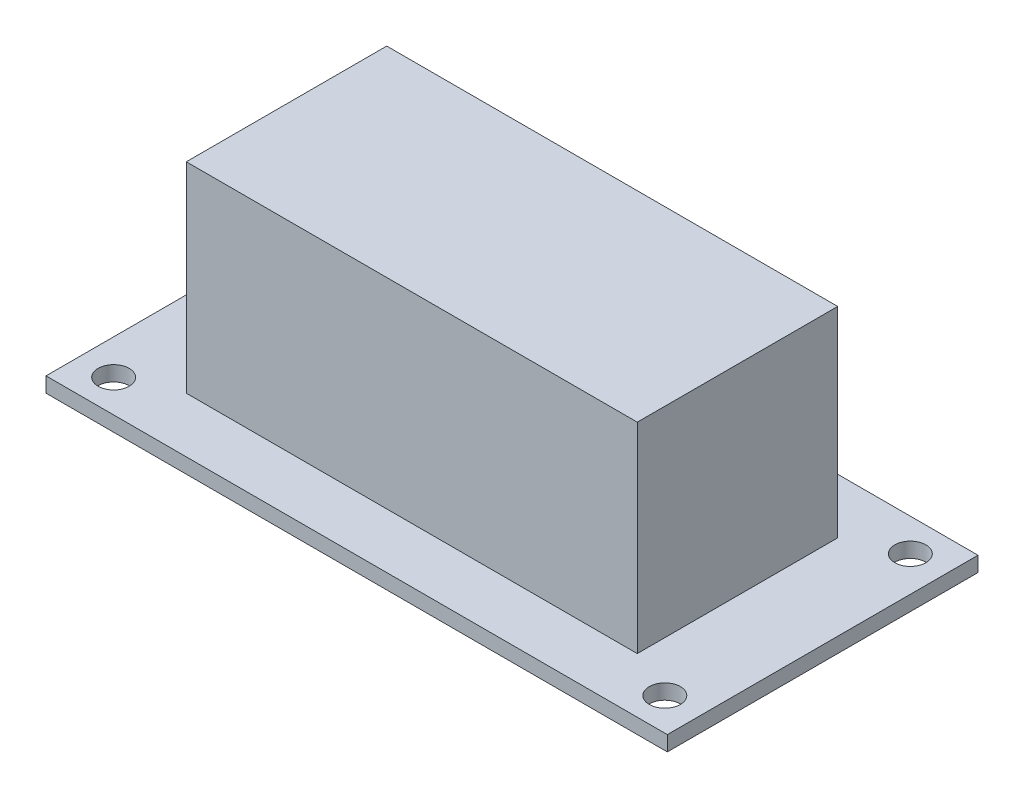
ISO-10303-21;
HEADER;
FILE_DESCRIPTION(('STEP AP214'),'2;1');
FILE_NAME('part.step','',(''),(''),'','','');
FILE_SCHEMA(('AUTOMOTIVE_DESIGN { 1 0 10303 214 1 1 1 1 }'));
ENDSEC;
DATA;
#1=APPLICATION_CONTEXT('core data for automotive mechanical design processes');
#2=APPLICATION_PROTOCOL_DEFINITION('international standard','automotive_design',2000,#1);
#3=PRODUCT_CONTEXT('',#1,'mechanical');
#4=PRODUCT('Part','Part','',(#3));
#5=PRODUCT_RELATED_PRODUCT_CATEGORY('part','',(#4));
#6=PRODUCT_DEFINITION_FORMATION('','',#4);
#7=PRODUCT_DEFINITION_CONTEXT('part definition',#1,'design');
#8=PRODUCT_DEFINITION('design','',#6,#7);
#9=PRODUCT_DEFINITION_SHAPE('','',#8);
#10=(LENGTH_UNIT() NAMED_UNIT(*) SI_UNIT(.MILLI.,.METRE.));
#11=(NAMED_UNIT(*) PLANE_ANGLE_UNIT() SI_UNIT($,.RADIAN.));
#12=(NAMED_UNIT(*) SI_UNIT($,.STERADIAN.) SOLID_ANGLE_UNIT());
#13=UNCERTAINTY_MEASURE_WITH_UNIT(LENGTH_MEASURE(1.E-05),#10,'distance_accuracy_value','');
#14=(GEOMETRIC_REPRESENTATION_CONTEXT(3) GLOBAL_UNCERTAINTY_ASSIGNED_CONTEXT((#13)) GLOBAL_UNIT_ASSIGNED_CONTEXT((#10,
#11,#12)) REPRESENTATION_CONTEXT('',''));
#15=CARTESIAN_POINT('',(0.,0.,0.));
#16=DIRECTION('',(0.,0.,1.));
#17=DIRECTION('',(1.,0.,0.));
#18=AXIS2_PLACEMENT_3D('',#15,#16,#17);
#19=CARTESIAN_POINT('',(0.,1.5,0.));
#20=DIRECTION('',(0.,-1.,0.));
#21=DIRECTION('',(0.,0.,-1.));
#22=AXIS2_PLACEMENT_3D('',#19,#20,#21);
#23=PLANE('',#22);
#24=CARTESIAN_POINT('',(-27.5,1.5,12.25));
#25=DIRECTION('',(0.,1.,0.));
#26=DIRECTION('',(0.,0.,1.));
#27=AXIS2_PLACEMENT_3D('',#24,#25,#26);
#28=CIRCLE('',#27,1.55);
#29=CARTESIAN_POINT('',(-27.5,1.5,13.8));
#30=VERTEX_POINT('',#29);
#31=EDGE_CURVE('E122',#30,#30,#28,.T.);
#32=ORIENTED_EDGE('',*,*,#31,.F.);
#33=EDGE_LOOP('',(#32));
#34=FACE_BOUND('',#33,.T.);
#35=CARTESIAN_POINT('',(27.5,1.5,12.25));
#36=DIRECTION('',(0.,1.,0.));
#37=DIRECTION('',(0.,0.,1.));
#38=AXIS2_PLACEMENT_3D('',#35,#36,#37);
#39=CIRCLE('',#38,1.55);
#40=CARTESIAN_POINT('',(27.5,1.5,13.8));
#41=VERTEX_POINT('',#40);
#42=EDGE_CURVE('E131',#41,#41,#39,.T.);
#43=ORIENTED_EDGE('',*,*,#42,.F.);
#44=EDGE_LOOP('',(#43));
#45=FACE_BOUND('',#44,.T.);
#46=CARTESIAN_POINT('',(27.5,1.5,-12.25));
#47=DIRECTION('',(0.,1.,0.));
#48=DIRECTION('',(0.,0.,1.));
#49=AXIS2_PLACEMENT_3D('',#46,#47,#48);
#50=CIRCLE('',#49,1.55);
#51=CARTESIAN_POINT('',(27.5,1.5,-10.7));
#52=VERTEX_POINT('',#51);
#53=EDGE_CURVE('E137',#52,#52,#50,.T.);
#54=ORIENTED_EDGE('',*,*,#53,.F.);
#55=EDGE_LOOP('',(#54));
#56=FACE_BOUND('',#55,.T.);
#57=CARTESIAN_POINT('',(-27.5,1.5,-12.25));
#58=DIRECTION('',(0.,1.,0.));
#59=DIRECTION('',(0.,0.,1.));
#60=AXIS2_PLACEMENT_3D('',#57,#58,#59);
#61=CIRCLE('',#60,1.55);
#62=CARTESIAN_POINT('',(-27.5,1.5,-10.7));
#63=VERTEX_POINT('',#62);
#64=EDGE_CURVE('E143',#63,#63,#61,.T.);
#65=ORIENTED_EDGE('',*,*,#64,.F.);
#66=EDGE_LOOP('',(#65));
#67=FACE_BOUND('',#66,.T.);
#68=DIRECTION('',(0.,0.,-1.));
#69=VECTOR('',#68,1.);
#70=CARTESIAN_POINT('',(31.,1.5,15.5));
#71=LINE('',#70,#69);
#72=CARTESIAN_POINT('',(31.,1.5,15.5));
#73=VERTEX_POINT('',#72);
#74=CARTESIAN_POINT('',(31.,1.5,-15.5));
#75=VERTEX_POINT('',#74);
#76=EDGE_CURVE('E149',#73,#75,#71,.T.);
#77=ORIENTED_EDGE('',*,*,#76,.T.);
#78=DIRECTION('',(-1.,0.,0.));
#79=VECTOR('',#78,1.);
#80=CARTESIAN_POINT('',(-31.,1.5,-15.5));
#81=LINE('',#80,#79);
#82=CARTESIAN_POINT('',(-31.,1.5,-15.5));
#83=VERTEX_POINT('',#82);
#84=EDGE_CURVE('E152',#75,#83,#81,.T.);
#85=ORIENTED_EDGE('',*,*,#84,.T.);
#86=DIRECTION('',(0.,0.,1.));
#87=VECTOR('',#86,1.);
#88=CARTESIAN_POINT('',(-31.,1.5,15.5));
#89=LINE('',#88,#87);
#90=CARTESIAN_POINT('',(-31.,1.5,15.5));
#91=VERTEX_POINT('',#90);
#92=EDGE_CURVE('E155',#83,#91,#89,.T.);
#93=ORIENTED_EDGE('',*,*,#92,.T.);
#94=DIRECTION('',(1.,0.,0.));
#95=VECTOR('',#94,1.);
#96=CARTESIAN_POINT('',(-31.,1.5,15.5));
#97=LINE('',#96,#95);
#98=EDGE_CURVE('E157',#91,#73,#97,.T.);
#99=ORIENTED_EDGE('',*,*,#98,.T.);
#100=EDGE_LOOP('',(#77,#85,#93,#99));
#101=FACE_BOUND('',#100,.T.);
#102=DIRECTION('',(0.,0.,-1.));
#103=VECTOR('',#102,1.);
#104=CARTESIAN_POINT('',(22.5,1.5,10.));
#105=LINE('',#104,#103);
#106=CARTESIAN_POINT('',(22.5,1.5,10.));
#107=VERTEX_POINT('',#106);
#108=CARTESIAN_POINT('',(22.5,1.5,-10.));
#109=VERTEX_POINT('',#108);
#110=EDGE_CURVE('E49',#107,#109,#105,.T.);
#111=ORIENTED_EDGE('',*,*,#110,.F.);
#112=DIRECTION('',(1.,0.,0.));
#113=VECTOR('',#112,1.);
#114=CARTESIAN_POINT('',(-22.5,1.5,10.));
#115=LINE('',#114,#113);
#116=CARTESIAN_POINT('',(-22.5,1.5,10.));
#117=VERTEX_POINT('',#116);
#118=EDGE_CURVE('E53',#117,#107,#115,.T.);
#119=ORIENTED_EDGE('',*,*,#118,.F.);
#120=DIRECTION('',(0.,0.,1.));
#121=VECTOR('',#120,1.);
#122=CARTESIAN_POINT('',(-22.5,1.5,10.));
#123=LINE('',#122,#121);
#124=CARTESIAN_POINT('',(-22.5,1.5,-10.));
#125=VERTEX_POINT('',#124);
#126=EDGE_CURVE('E336',#125,#117,#123,.T.);
#127=ORIENTED_EDGE('',*,*,#126,.F.);
#128=DIRECTION('',(-1.,0.,0.));
#129=VECTOR('',#128,1.);
#130=CARTESIAN_POINT('',(-22.5,1.5,-10.));
#131=LINE('',#130,#129);
#132=EDGE_CURVE('E342',#109,#125,#131,.T.);
#133=ORIENTED_EDGE('',*,*,#132,.F.);
#134=EDGE_LOOP('',(#111,#119,#127,#133));
#135=FACE_BOUND('',#134,.T.);
#136=ADVANCED_FACE('F34',(#34,#45,#56,#67,#101,#135),#23,.F.);
#137=CARTESIAN_POINT('',(0.,0.,0.));
#138=DIRECTION('',(0.,-1.,0.));
#139=DIRECTION('',(0.,0.,-1.));
#140=AXIS2_PLACEMENT_3D('',#137,#138,#139);
#141=PLANE('',#140);
#142=CARTESIAN_POINT('',(27.5,0.,12.25));
#143=DIRECTION('',(0.,1.,0.));
#144=DIRECTION('',(0.,0.,1.));
#145=AXIS2_PLACEMENT_3D('',#142,#143,#144);
#146=CIRCLE('',#145,1.55);
#147=CARTESIAN_POINT('',(27.5,0.,13.8));
#148=VERTEX_POINT('',#147);
#149=EDGE_CURVE('E129',#148,#148,#146,.T.);
#150=ORIENTED_EDGE('',*,*,#149,.T.);
#151=EDGE_LOOP('',(#150));
#152=FACE_BOUND('',#151,.T.);
#153=CARTESIAN_POINT('',(-27.5,0.,-12.25));
#154=DIRECTION('',(0.,1.,0.));
#155=DIRECTION('',(0.,0.,1.));
#156=AXIS2_PLACEMENT_3D('',#153,#154,#155);
#157=CIRCLE('',#156,1.55);
#158=CARTESIAN_POINT('',(-27.5,0.,-10.7));
#159=VERTEX_POINT('',#158);
#160=EDGE_CURVE('E140',#159,#159,#157,.T.);
#161=ORIENTED_EDGE('',*,*,#160,.T.);
#162=EDGE_LOOP('',(#161));
#163=FACE_BOUND('',#162,.T.);
#164=DIRECTION('',(0.,0.,-1.));
#165=VECTOR('',#164,1.);
#166=CARTESIAN_POINT('',(31.,0.,15.5));
#167=LINE('',#166,#165);
#168=CARTESIAN_POINT('',(31.,0.,15.5));
#169=VERTEX_POINT('',#168);
#170=CARTESIAN_POINT('',(31.,0.,-15.5));
#171=VERTEX_POINT('',#170);
#172=EDGE_CURVE('E146',#169,#171,#167,.T.);
#173=ORIENTED_EDGE('',*,*,#172,.F.);
#174=DIRECTION('',(1.,0.,0.));
#175=VECTOR('',#174,1.);
#176=CARTESIAN_POINT('',(-31.,0.,15.5));
#177=LINE('',#176,#175);
#178=CARTESIAN_POINT('',(-31.,0.,15.5));
#179=VERTEX_POINT('',#178);
#180=EDGE_CURVE('E153',#179,#169,#177,.T.);
#181=ORIENTED_EDGE('',*,*,#180,.F.);
#182=DIRECTION('',(0.,0.,1.));
#183=VECTOR('',#182,1.);
#184=CARTESIAN_POINT('',(-31.,0.,15.5));
#185=LINE('',#184,#183);
#186=CARTESIAN_POINT('',(-31.,0.,-15.5));
#187=VERTEX_POINT('',#186);
#188=EDGE_CURVE('E164',#187,#179,#185,.T.);
#189=ORIENTED_EDGE('',*,*,#188,.F.);
#190=DIRECTION('',(-1.,0.,0.));
#191=VECTOR('',#190,1.);
#192=CARTESIAN_POINT('',(-31.,0.,-15.5));
#193=LINE('',#192,#191);
#194=EDGE_CURVE('E162',#171,#187,#193,.T.);
#195=ORIENTED_EDGE('',*,*,#194,.F.);
#196=EDGE_LOOP('',(#173,#181,#189,#195));
#197=FACE_BOUND('',#196,.T.);
#198=CARTESIAN_POINT('',(27.5,0.,-12.25));
#199=DIRECTION('',(0.,1.,0.));
#200=DIRECTION('',(0.,0.,1.));
#201=AXIS2_PLACEMENT_3D('',#198,#199,#200);
#202=CIRCLE('',#201,1.55);
#203=CARTESIAN_POINT('',(27.5,0.,-10.7));
#204=VERTEX_POINT('',#203);
#205=EDGE_CURVE('E134',#204,#204,#202,.T.);
#206=ORIENTED_EDGE('',*,*,#205,.T.);
#207=EDGE_LOOP('',(#206));
#208=FACE_BOUND('',#207,.T.);
#209=CARTESIAN_POINT('',(-27.5,0.,12.25));
#210=DIRECTION('',(0.,1.,0.));
#211=DIRECTION('',(0.,0.,1.));
#212=AXIS2_PLACEMENT_3D('',#209,#210,#211);
#213=CIRCLE('',#212,1.55);
#214=CARTESIAN_POINT('',(-27.5,0.,13.8));
#215=VERTEX_POINT('',#214);
#216=EDGE_CURVE('E119',#215,#215,#213,.T.);
#217=ORIENTED_EDGE('',*,*,#216,.T.);
#218=EDGE_LOOP('',(#217));
#219=FACE_BOUND('',#218,.T.);
#220=ADVANCED_FACE('F182',(#152,#163,#197,#208,#219),#141,.T.);
#221=CARTESIAN_POINT('',(31.,1.5,15.5));
#222=DIRECTION('',(-1.,0.,0.));
#223=DIRECTION('',(0.,0.,1.));
#224=AXIS2_PLACEMENT_3D('',#221,#222,#223);
#225=PLANE('',#224);
#226=ORIENTED_EDGE('',*,*,#172,.T.);
#227=DIRECTION('',(0.,-1.,0.));
#228=VECTOR('',#227,1.);
#229=CARTESIAN_POINT('',(31.,1.5,-15.5));
#230=LINE('',#229,#228);
#231=EDGE_CURVE('E11',#75,#171,#230,.T.);
#232=ORIENTED_EDGE('',*,*,#231,.F.);
#233=ORIENTED_EDGE('',*,*,#76,.F.);
#234=DIRECTION('',(0.,-1.,0.));
#235=VECTOR('',#234,1.);
#236=CARTESIAN_POINT('',(31.,1.5,15.5));
#237=LINE('',#236,#235);
#238=EDGE_CURVE('E159',#73,#169,#237,.T.);
#239=ORIENTED_EDGE('',*,*,#238,.T.);
#240=EDGE_LOOP('',(#226,#232,#233,#239));
#241=FACE_BOUND('',#240,.T.);
#242=ADVANCED_FACE('F36',(#241),#225,.F.);
#243=CARTESIAN_POINT('',(-31.,1.5,-15.5));
#244=DIRECTION('',(0.,0.,1.));
#245=DIRECTION('',(1.,0.,0.));
#246=AXIS2_PLACEMENT_3D('',#243,#244,#245);
#247=PLANE('',#246);
#248=ORIENTED_EDGE('',*,*,#194,.T.);
#249=DIRECTION('',(0.,-1.,0.));
#250=VECTOR('',#249,1.);
#251=CARTESIAN_POINT('',(-31.,1.5,-15.5));
#252=LINE('',#251,#250);
#253=EDGE_CURVE('E42',#83,#187,#252,.T.);
#254=ORIENTED_EDGE('',*,*,#253,.F.);
#255=ORIENTED_EDGE('',*,*,#84,.F.);
#256=ORIENTED_EDGE('',*,*,#231,.T.);
#257=EDGE_LOOP('',(#248,#254,#255,#256));
#258=FACE_BOUND('',#257,.T.);
#259=ADVANCED_FACE('F192',(#258),#247,.F.);
#260=CARTESIAN_POINT('',(-31.,1.5,15.5));
#261=DIRECTION('',(1.,0.,0.));
#262=DIRECTION('',(0.,0.,-1.));
#263=AXIS2_PLACEMENT_3D('',#260,#261,#262);
#264=PLANE('',#263);
#265=ORIENTED_EDGE('',*,*,#188,.T.);
#266=DIRECTION('',(0.,-1.,0.));
#267=VECTOR('',#266,1.);
#268=CARTESIAN_POINT('',(-31.,1.5,15.5));
#269=LINE('',#268,#267);
#270=EDGE_CURVE('E169',#91,#179,#269,.T.);
#271=ORIENTED_EDGE('',*,*,#270,.F.);
#272=ORIENTED_EDGE('',*,*,#92,.F.);
#273=ORIENTED_EDGE('',*,*,#253,.T.);
#274=EDGE_LOOP('',(#265,#271,#272,#273));
#275=FACE_BOUND('',#274,.T.);
#276=ADVANCED_FACE('F176',(#275),#264,.F.);
#277=CARTESIAN_POINT('',(-31.,1.5,15.5));
#278=DIRECTION('',(0.,0.,-1.));
#279=DIRECTION('',(-1.,0.,0.));
#280=AXIS2_PLACEMENT_3D('',#277,#278,#279);
#281=PLANE('',#280);
#282=ORIENTED_EDGE('',*,*,#180,.T.);
#283=ORIENTED_EDGE('',*,*,#238,.F.);
#284=ORIENTED_EDGE('',*,*,#98,.F.);
#285=ORIENTED_EDGE('',*,*,#270,.T.);
#286=EDGE_LOOP('',(#282,#283,#284,#285));
#287=FACE_BOUND('',#286,.T.);
#288=ADVANCED_FACE('F186',(#287),#281,.F.);
#289=CARTESIAN_POINT('',(-27.5,1.5,-12.25));
#290=DIRECTION('',(0.,-1.,0.));
#291=DIRECTION('',(0.,0.,-1.));
#292=AXIS2_PLACEMENT_3D('',#289,#290,#291);
#293=CYLINDRICAL_SURFACE('',#292,1.55);
#294=ORIENTED_EDGE('',*,*,#64,.T.);
#295=EDGE_LOOP('',(#294));
#296=FACE_BOUND('',#295,.T.);
#297=ORIENTED_EDGE('',*,*,#160,.F.);
#298=EDGE_LOOP('',(#297));
#299=FACE_BOUND('',#298,.T.);
#300=ADVANCED_FACE('F210',(#296,#299),#293,.F.);
#301=CARTESIAN_POINT('',(27.5,1.5,-12.25));
#302=DIRECTION('',(0.,-1.,0.));
#303=DIRECTION('',(0.,0.,-1.));
#304=AXIS2_PLACEMENT_3D('',#301,#302,#303);
#305=CYLINDRICAL_SURFACE('',#304,1.55);
#306=ORIENTED_EDGE('',*,*,#53,.T.);
#307=EDGE_LOOP('',(#306));
#308=FACE_BOUND('',#307,.T.);
#309=ORIENTED_EDGE('',*,*,#205,.F.);
#310=EDGE_LOOP('',(#309));
#311=FACE_BOUND('',#310,.T.);
#312=ADVANCED_FACE('F217',(#308,#311),#305,.F.);
#313=CARTESIAN_POINT('',(27.5,1.5,12.25));
#314=DIRECTION('',(0.,-1.,0.));
#315=DIRECTION('',(0.,0.,-1.));
#316=AXIS2_PLACEMENT_3D('',#313,#314,#315);
#317=CYLINDRICAL_SURFACE('',#316,1.55);
#318=ORIENTED_EDGE('',*,*,#42,.T.);
#319=EDGE_LOOP('',(#318));
#320=FACE_BOUND('',#319,.T.);
#321=ORIENTED_EDGE('',*,*,#149,.F.);
#322=EDGE_LOOP('',(#321));
#323=FACE_BOUND('',#322,.T.);
#324=ADVANCED_FACE('F222',(#320,#323),#317,.F.);
#325=CARTESIAN_POINT('',(-27.5,1.5,12.25));
#326=DIRECTION('',(0.,-1.,0.));
#327=DIRECTION('',(0.,0.,-1.));
#328=AXIS2_PLACEMENT_3D('',#325,#326,#327);
#329=CYLINDRICAL_SURFACE('',#328,1.55);
#330=ORIENTED_EDGE('',*,*,#31,.T.);
#331=EDGE_LOOP('',(#330));
#332=FACE_BOUND('',#331,.T.);
#333=ORIENTED_EDGE('',*,*,#216,.F.);
#334=EDGE_LOOP('',(#333));
#335=FACE_BOUND('',#334,.T.);
#336=ADVANCED_FACE('F232',(#332,#335),#329,.F.);
#337=CARTESIAN_POINT('',(22.5,21.5,10.));
#338=DIRECTION('',(-1.,0.,0.));
#339=DIRECTION('',(0.,0.,1.));
#340=AXIS2_PLACEMENT_3D('',#337,#338,#339);
#341=PLANE('',#340);
#342=ORIENTED_EDGE('',*,*,#110,.T.);
#343=DIRECTION('',(0.,-1.,0.));
#344=VECTOR('',#343,1.);
#345=CARTESIAN_POINT('',(22.5,21.5,-10.));
#346=LINE('',#345,#344);
#347=CARTESIAN_POINT('',(22.5,21.5,-10.));
#348=VERTEX_POINT('',#347);
#349=EDGE_CURVE('E102',#348,#109,#346,.T.);
#350=ORIENTED_EDGE('',*,*,#349,.F.);
#351=DIRECTION('',(0.,0.,-1.));
#352=VECTOR('',#351,1.);
#353=CARTESIAN_POINT('',(22.5,21.5,10.));
#354=LINE('',#353,#352);
#355=CARTESIAN_POINT('',(22.5,21.5,10.));
#356=VERTEX_POINT('',#355);
#357=EDGE_CURVE('E108',#356,#348,#354,.T.);
#358=ORIENTED_EDGE('',*,*,#357,.F.);
#359=DIRECTION('',(0.,-1.,0.));
#360=VECTOR('',#359,1.);
#361=CARTESIAN_POINT('',(22.5,21.5,10.));
#362=LINE('',#361,#360);
#363=EDGE_CURVE('E334',#356,#107,#362,.T.);
#364=ORIENTED_EDGE('',*,*,#363,.T.);
#365=EDGE_LOOP('',(#342,#350,#358,#364));
#366=FACE_BOUND('',#365,.T.);
#367=ADVANCED_FACE('F118',(#366),#341,.F.);
#368=CARTESIAN_POINT('',(-22.5,21.5,-10.));
#369=DIRECTION('',(0.,0.,1.));
#370=DIRECTION('',(1.,0.,0.));
#371=AXIS2_PLACEMENT_3D('',#368,#369,#370);
#372=PLANE('',#371);
#373=ORIENTED_EDGE('',*,*,#132,.T.);
#374=DIRECTION('',(0.,-1.,0.));
#375=VECTOR('',#374,1.);
#376=CARTESIAN_POINT('',(-22.5,21.5,-10.));
#377=LINE('',#376,#375);
#378=CARTESIAN_POINT('',(-22.5,21.5,-10.));
#379=VERTEX_POINT('',#378);
#380=EDGE_CURVE('E104',#379,#125,#377,.T.);
#381=ORIENTED_EDGE('',*,*,#380,.F.);
#382=DIRECTION('',(-1.,0.,0.));
#383=VECTOR('',#382,1.);
#384=CARTESIAN_POINT('',(-22.5,21.5,-10.));
#385=LINE('',#384,#383);
#386=EDGE_CURVE('E97',#348,#379,#385,.T.);
#387=ORIENTED_EDGE('',*,*,#386,.F.);
#388=ORIENTED_EDGE('',*,*,#349,.T.);
#389=EDGE_LOOP('',(#373,#381,#387,#388));
#390=FACE_BOUND('',#389,.T.);
#391=ADVANCED_FACE('F100',(#390),#372,.F.);
#392=CARTESIAN_POINT('',(-22.5,21.5,10.));
#393=DIRECTION('',(1.,0.,0.));
#394=DIRECTION('',(0.,0.,-1.));
#395=AXIS2_PLACEMENT_3D('',#392,#393,#394);
#396=PLANE('',#395);
#397=ORIENTED_EDGE('',*,*,#126,.T.);
#398=DIRECTION('',(0.,-1.,0.));
#399=VECTOR('',#398,1.);
#400=CARTESIAN_POINT('',(-22.5,21.5,10.));
#401=LINE('',#400,#399);
#402=CARTESIAN_POINT('',(-22.5,21.5,10.));
#403=VERTEX_POINT('',#402);
#404=EDGE_CURVE('E124',#403,#117,#401,.T.);
#405=ORIENTED_EDGE('',*,*,#404,.F.);
#406=DIRECTION('',(0.,0.,1.));
#407=VECTOR('',#406,1.);
#408=CARTESIAN_POINT('',(-22.5,21.5,10.));
#409=LINE('',#408,#407);
#410=EDGE_CURVE('E107',#379,#403,#409,.T.);
#411=ORIENTED_EDGE('',*,*,#410,.F.);
#412=ORIENTED_EDGE('',*,*,#380,.T.);
#413=EDGE_LOOP('',(#397,#405,#411,#412));
#414=FACE_BOUND('',#413,.T.);
#415=ADVANCED_FACE('F244',(#414),#396,.F.);
#416=CARTESIAN_POINT('',(-22.5,21.5,10.));
#417=DIRECTION('',(0.,0.,-1.));
#418=DIRECTION('',(-1.,0.,0.));
#419=AXIS2_PLACEMENT_3D('',#416,#417,#418);
#420=PLANE('',#419);
#421=ORIENTED_EDGE('',*,*,#118,.T.);
#422=ORIENTED_EDGE('',*,*,#363,.F.);
#423=DIRECTION('',(1.,0.,0.));
#424=VECTOR('',#423,1.);
#425=CARTESIAN_POINT('',(-22.5,21.5,10.));
#426=LINE('',#425,#424);
#427=EDGE_CURVE('E113',#403,#356,#426,.T.);
#428=ORIENTED_EDGE('',*,*,#427,.F.);
#429=ORIENTED_EDGE('',*,*,#404,.T.);
#430=EDGE_LOOP('',(#421,#422,#428,#429));
#431=FACE_BOUND('',#430,.T.);
#432=ADVANCED_FACE('F247',(#431),#420,.F.);
#433=CARTESIAN_POINT('',(0.,21.5,0.));
#434=DIRECTION('',(0.,-1.,0.));
#435=DIRECTION('',(0.,0.,-1.));
#436=AXIS2_PLACEMENT_3D('',#433,#434,#435);
#437=PLANE('',#436);
#438=ORIENTED_EDGE('',*,*,#357,.T.);
#439=ORIENTED_EDGE('',*,*,#386,.T.);
#440=ORIENTED_EDGE('',*,*,#410,.T.);
#441=ORIENTED_EDGE('',*,*,#427,.T.);
#442=EDGE_LOOP('',(#438,#439,#440,#441));
#443=FACE_BOUND('',#442,.T.);
#444=ADVANCED_FACE('F111',(#443),#437,.F.);
#445=CLOSED_SHELL('',(#136,#220,#242,#259,#276,#288,#300,#312,#324,#336,#367,#391,#415,#432,#444));
#446=MANIFOLD_SOLID_BREP('B2',#445);
#447=ADVANCED_BREP_SHAPE_REPRESENTATION('',(#18,#446),#14);
#448=SHAPE_DEFINITION_REPRESENTATION(#9,#447);
ENDSEC;
END-ISO-10303-21;
